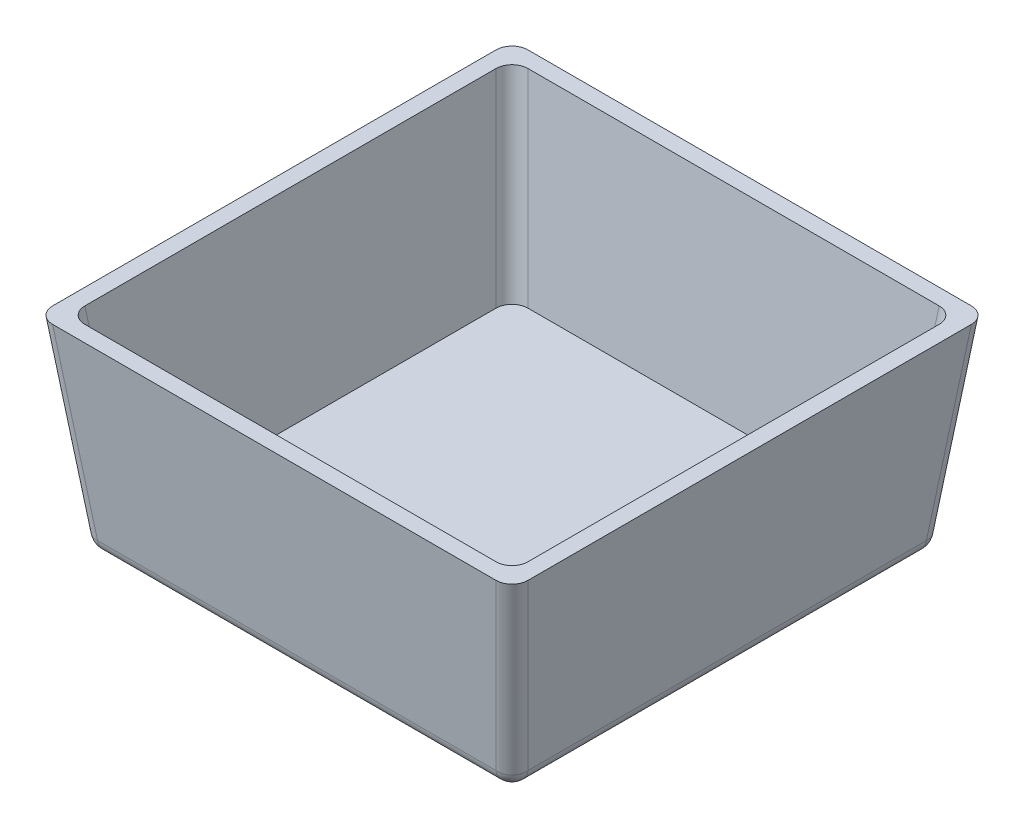
ISO-10303-21;
HEADER;
FILE_DESCRIPTION(('STEP AP214'),'2;1');
FILE_NAME('part.step','',(''),(''),'','','');
FILE_SCHEMA(('AUTOMOTIVE_DESIGN { 1 0 10303 214 1 1 1 1 }'));
ENDSEC;
DATA;
#1=APPLICATION_CONTEXT('core data for automotive mechanical design processes');
#2=APPLICATION_PROTOCOL_DEFINITION('international standard','automotive_design',2000,#1);
#3=PRODUCT_CONTEXT('',#1,'mechanical');
#4=PRODUCT('Part','Part','',(#3));
#5=PRODUCT_RELATED_PRODUCT_CATEGORY('part','',(#4));
#6=PRODUCT_DEFINITION_FORMATION('','',#4);
#7=PRODUCT_DEFINITION_CONTEXT('part definition',#1,'design');
#8=PRODUCT_DEFINITION('design','',#6,#7);
#9=PRODUCT_DEFINITION_SHAPE('','',#8);
#10=(LENGTH_UNIT() NAMED_UNIT(*) SI_UNIT(.MILLI.,.METRE.));
#11=(NAMED_UNIT(*) PLANE_ANGLE_UNIT() SI_UNIT($,.RADIAN.));
#12=(NAMED_UNIT(*) SI_UNIT($,.STERADIAN.) SOLID_ANGLE_UNIT());
#13=UNCERTAINTY_MEASURE_WITH_UNIT(LENGTH_MEASURE(1.E-05),#10,'distance_accuracy_value','');
#14=(GEOMETRIC_REPRESENTATION_CONTEXT(3) GLOBAL_UNCERTAINTY_ASSIGNED_CONTEXT((#13)) GLOBAL_UNIT_ASSIGNED_CONTEXT((#10,
#11,#12)) REPRESENTATION_CONTEXT('',''));
#15=CARTESIAN_POINT('',(0.,0.,0.));
#16=DIRECTION('',(0.,0.,1.));
#17=DIRECTION('',(1.,0.,0.));
#18=AXIS2_PLACEMENT_3D('',#15,#16,#17);
#19=CARTESIAN_POINT('',(0.,-2.89826498422713,-24.1522082018927));
#20=DIRECTION('',(0.,-0.119145220618431,-0.992876838486922));
#21=DIRECTION('',(0.,0.992876838486922,-0.119145220618431));
#22=AXIS2_PLACEMENT_3D('',#19,#20,#21);
#23=PLANE('',#22);
#24=DIRECTION('',(1.,0.,0.));
#25=VECTOR('',#24,1.);
#26=CARTESIAN_POINT('',(-27.5,25.,-27.5));
#27=LINE('',#26,#25);
#28=CARTESIAN_POINT('',(-25.5142463230262,25.,-27.5));
#29=VERTEX_POINT('',#28);
#30=CARTESIAN_POINT('',(25.5142463230261,25.,-27.5));
#31=VERTEX_POINT('',#30);
#32=EDGE_CURVE('E373',#29,#31,#27,.T.);
#33=ORIENTED_EDGE('',*,*,#32,.F.);
#34=DIRECTION('',(-0.118308451008765,0.985903758406374,-0.118308451008765));
#35=VECTOR('',#34,1.);
#36=CARTESIAN_POINT('',(-22.782040697976,2.23161979124889,-24.7677943749499));
#37=LINE('',#36,#35);
#38=CARTESIAN_POINT('',(-22.7542463230262,2.,-24.74));
#39=VERTEX_POINT('',#38);
#40=EDGE_CURVE('E505',#29,#39,#37,.F.);
#41=ORIENTED_EDGE('',*,*,#40,.T.);
#42=DIRECTION('',(-1.,0.,0.));
#43=VECTOR('',#42,1.);
#44=CARTESIAN_POINT('',(0.,2.,-24.74));
#45=LINE('',#44,#43);
#46=CARTESIAN_POINT('',(22.7542463230261,2.,-24.74));
#47=VERTEX_POINT('',#46);
#48=EDGE_CURVE('E282',#47,#39,#45,.T.);
#49=ORIENTED_EDGE('',*,*,#48,.F.);
#50=DIRECTION('',(0.118308451008765,0.985903758406374,-0.118308451008765));
#51=VECTOR('',#50,1.);
#52=CARTESIAN_POINT('',(21.8561931085514,-5.48377678728922,-23.8419467855253));
#53=LINE('',#52,#51);
#54=EDGE_CURVE('E392',#47,#31,#53,.T.);
#55=ORIENTED_EDGE('',*,*,#54,.T.);
#56=EDGE_LOOP('',(#33,#41,#49,#55));
#57=FACE_BOUND('',#56,.T.);
#58=ADVANCED_FACE('F57',(#57),#23,.F.);
#59=CARTESIAN_POINT('',(24.1522082018927,-2.89826498422713,0.));
#60=DIRECTION('',(-0.992876838486922,0.119145220618431,0.));
#61=DIRECTION('',(-0.119145220618431,-0.992876838486922,0.));
#62=AXIS2_PLACEMENT_3D('',#59,#60,#61);
#63=PLANE('',#62);
#64=DIRECTION('',(0.,0.,1.));
#65=VECTOR('',#64,1.);
#66=CARTESIAN_POINT('',(24.74,2.,0.));
#67=LINE('',#66,#65);
#68=CARTESIAN_POINT('',(24.74,2.,-22.7542463230261));
#69=VERTEX_POINT('',#68);
#70=CARTESIAN_POINT('',(24.74,2.,22.7542463230262));
#71=VERTEX_POINT('',#70);
#72=EDGE_CURVE('E425',#69,#71,#67,.T.);
#73=ORIENTED_EDGE('',*,*,#72,.T.);
#74=DIRECTION('',(0.118308451008765,0.985903758406374,0.118308451008765));
#75=VECTOR('',#74,1.);
#76=CARTESIAN_POINT('',(27.5277943749499,25.2316197912489,25.542040697976));
#77=LINE('',#76,#75);
#78=CARTESIAN_POINT('',(27.5,25.,25.5142463230262));
#79=VERTEX_POINT('',#78);
#80=EDGE_CURVE('E500',#71,#79,#77,.T.);
#81=ORIENTED_EDGE('',*,*,#80,.T.);
#82=DIRECTION('',(0.,0.,-1.));
#83=VECTOR('',#82,1.);
#84=CARTESIAN_POINT('',(27.5,25.,27.5));
#85=LINE('',#84,#83);
#86=CARTESIAN_POINT('',(27.5,25.,-25.5142463230261));
#87=VERTEX_POINT('',#86);
#88=EDGE_CURVE('E357',#79,#87,#85,.T.);
#89=ORIENTED_EDGE('',*,*,#88,.T.);
#90=DIRECTION('',(0.118308451008765,0.985903758406374,-0.118308451008765));
#91=VECTOR('',#90,1.);
#92=CARTESIAN_POINT('',(23.8419467855253,-5.48377678728921,-21.8561931085514));
#93=LINE('',#92,#91);
#94=EDGE_CURVE('E503',#87,#69,#93,.F.);
#95=ORIENTED_EDGE('',*,*,#94,.T.);
#96=EDGE_LOOP('',(#73,#81,#89,#95));
#97=FACE_BOUND('',#96,.T.);
#98=ADVANCED_FACE('F536',(#97),#63,.T.);
#99=CARTESIAN_POINT('',(-24.1522082018927,-2.89826498422713,0.));
#100=DIRECTION('',(-0.992876838486922,-0.119145220618431,0.));
#101=DIRECTION('',(0.119145220618431,-0.992876838486922,0.));
#102=AXIS2_PLACEMENT_3D('',#99,#100,#101);
#103=PLANE('',#102);
#104=DIRECTION('',(0.,0.,-1.));
#105=VECTOR('',#104,1.);
#106=CARTESIAN_POINT('',(-27.5,25.,27.5));
#107=LINE('',#106,#105);
#108=CARTESIAN_POINT('',(-27.5,25.,25.5142463230262));
#109=VERTEX_POINT('',#108);
#110=CARTESIAN_POINT('',(-27.5,25.,-25.5142463230261));
#111=VERTEX_POINT('',#110);
#112=EDGE_CURVE('E369',#109,#111,#107,.T.);
#113=ORIENTED_EDGE('',*,*,#112,.F.);
#114=DIRECTION('',(-0.118308451008765,0.985903758406374,0.118308451008765));
#115=VECTOR('',#114,1.);
#116=CARTESIAN_POINT('',(-23.8419467855253,-5.48377678728921,21.8561931085515));
#117=LINE('',#116,#115);
#118=CARTESIAN_POINT('',(-24.74,2.,22.7542463230262));
#119=VERTEX_POINT('',#118);
#120=EDGE_CURVE('E377',#109,#119,#117,.F.);
#121=ORIENTED_EDGE('',*,*,#120,.T.);
#122=DIRECTION('',(0.,0.,1.));
#123=VECTOR('',#122,1.);
#124=CARTESIAN_POINT('',(-24.74,2.,0.));
#125=LINE('',#124,#123);
#126=CARTESIAN_POINT('',(-24.74,2.,-22.7542463230261));
#127=VERTEX_POINT('',#126);
#128=EDGE_CURVE('E428',#127,#119,#125,.T.);
#129=ORIENTED_EDGE('',*,*,#128,.F.);
#130=DIRECTION('',(-0.118308451008765,0.985903758406374,-0.118308451008765));
#131=VECTOR('',#130,1.);
#132=CARTESIAN_POINT('',(-27.5277943749499,25.2316197912489,-25.542040697976));
#133=LINE('',#132,#131);
#134=EDGE_CURVE('E368',#127,#111,#133,.T.);
#135=ORIENTED_EDGE('',*,*,#134,.T.);
#136=EDGE_LOOP('',(#113,#121,#129,#135));
#137=FACE_BOUND('',#136,.T.);
#138=ADVANCED_FACE('F524',(#137),#103,.F.);
#139=CARTESIAN_POINT('',(0.,-2.89826498422713,24.1522082018927));
#140=DIRECTION('',(0.,0.119145220618431,-0.992876838486922));
#141=DIRECTION('',(0.,0.992876838486922,0.119145220618431));
#142=AXIS2_PLACEMENT_3D('',#139,#140,#141);
#143=PLANE('',#142);
#144=DIRECTION('',(-1.,0.,0.));
#145=VECTOR('',#144,1.);
#146=CARTESIAN_POINT('',(0.,2.,24.74));
#147=LINE('',#146,#145);
#148=CARTESIAN_POINT('',(22.7542463230261,2.,24.74));
#149=VERTEX_POINT('',#148);
#150=CARTESIAN_POINT('',(-22.7542463230262,2.,24.74));
#151=VERTEX_POINT('',#150);
#152=EDGE_CURVE('E210',#149,#151,#147,.T.);
#153=ORIENTED_EDGE('',*,*,#152,.T.);
#154=DIRECTION('',(-0.118308451008765,0.985903758406374,0.118308451008765));
#155=VECTOR('',#154,1.);
#156=CARTESIAN_POINT('',(-21.8561931085514,-5.48377678728921,23.8419467855253));
#157=LINE('',#156,#155);
#158=CARTESIAN_POINT('',(-25.5142463230262,25.,27.5));
#159=VERTEX_POINT('',#158);
#160=EDGE_CURVE('E363',#151,#159,#157,.T.);
#161=ORIENTED_EDGE('',*,*,#160,.T.);
#162=DIRECTION('',(1.,0.,0.));
#163=VECTOR('',#162,1.);
#164=CARTESIAN_POINT('',(-27.5,25.,27.5));
#165=LINE('',#164,#163);
#166=CARTESIAN_POINT('',(25.5142463230261,25.,27.5));
#167=VERTEX_POINT('',#166);
#168=EDGE_CURVE('E352',#159,#167,#165,.T.);
#169=ORIENTED_EDGE('',*,*,#168,.T.);
#170=DIRECTION('',(0.118308451008765,0.985903758406374,0.118308451008765));
#171=VECTOR('',#170,1.);
#172=CARTESIAN_POINT('',(22.782040697976,2.2316197912489,24.7677943749499));
#173=LINE('',#172,#171);
#174=EDGE_CURVE('E360',#167,#149,#173,.F.);
#175=ORIENTED_EDGE('',*,*,#174,.T.);
#176=EDGE_LOOP('',(#153,#161,#169,#175));
#177=FACE_BOUND('',#176,.T.);
#178=ADVANCED_FACE('F533',(#177),#143,.T.);
#179=CARTESIAN_POINT('',(0.,25.,0.));
#180=DIRECTION('',(0.,-1.,0.));
#181=DIRECTION('',(0.,0.,-1.));
#182=AXIS2_PLACEMENT_3D('',#179,#180,#181);
#183=PLANE('',#182);
#184=ORIENTED_EDGE('',*,*,#168,.F.);
#185=CARTESIAN_POINT('',(-25.4856514700777,25.,25.4856514700777));
#186=DIRECTION('',(0.,-1.,0.));
#187=DIRECTION('',(-0.707106781186548,0.,0.707106781186547));
#188=AXIS2_PLACEMENT_3D('',#185,#186,#187);
#189=ELLIPSE('',#188,2.02859557329695,2.);
#190=EDGE_CURVE('E482',#159,#109,#189,.T.);
#191=ORIENTED_EDGE('',*,*,#190,.T.);
#192=ORIENTED_EDGE('',*,*,#112,.T.);
#193=CARTESIAN_POINT('',(-25.4856514700777,25.,-25.4856514700777));
#194=DIRECTION('',(0.,-1.,0.));
#195=DIRECTION('',(0.707106781186547,0.,0.707106781186548));
#196=AXIS2_PLACEMENT_3D('',#193,#194,#195);
#197=ELLIPSE('',#196,2.02859557329695,2.);
#198=EDGE_CURVE('E479',#111,#29,#197,.T.);
#199=ORIENTED_EDGE('',*,*,#198,.T.);
#200=ORIENTED_EDGE('',*,*,#32,.T.);
#201=CARTESIAN_POINT('',(25.4856514700777,25.,-25.4856514700777));
#202=DIRECTION('',(0.,-1.,0.));
#203=DIRECTION('',(0.707106781186547,0.,-0.707106781186548));
#204=AXIS2_PLACEMENT_3D('',#201,#202,#203);
#205=ELLIPSE('',#204,2.02859557329695,2.);
#206=EDGE_CURVE('E12',#31,#87,#205,.T.);
#207=ORIENTED_EDGE('',*,*,#206,.T.);
#208=ORIENTED_EDGE('',*,*,#88,.F.);
#209=CARTESIAN_POINT('',(25.4856514700777,25.,25.4856514700777));
#210=DIRECTION('',(0.,-1.,0.));
#211=DIRECTION('',(-0.707106781186548,0.,-0.707106781186547));
#212=AXIS2_PLACEMENT_3D('',#209,#210,#211);
#213=ELLIPSE('',#212,2.02859557329695,2.);
#214=EDGE_CURVE('E68',#79,#167,#213,.T.);
#215=ORIENTED_EDGE('',*,*,#214,.T.);
#216=EDGE_LOOP('',(#184,#191,#192,#199,#200,#207,#208,#215));
#217=FACE_BOUND('',#216,.T.);
#218=DIRECTION('',(1.,0.,0.));
#219=VECTOR('',#218,1.);
#220=CARTESIAN_POINT('',(-29.5,25.,29.5));
#221=LINE('',#220,#219);
#222=CARTESIAN_POINT('',(-27.5142463230262,25.,29.5));
#223=VERTEX_POINT('',#222);
#224=CARTESIAN_POINT('',(27.5142463230261,25.,29.5));
#225=VERTEX_POINT('',#224);
#226=EDGE_CURVE('E61',#223,#225,#221,.T.);
#227=ORIENTED_EDGE('',*,*,#226,.T.);
#228=CARTESIAN_POINT('',(27.4856514700777,25.,27.4856514700777));
#229=DIRECTION('',(0.,-1.,0.));
#230=DIRECTION('',(0.707106781186548,0.,0.707106781186547));
#231=AXIS2_PLACEMENT_3D('',#228,#229,#230);
#232=ELLIPSE('',#231,2.02859557329695,2.);
#233=CARTESIAN_POINT('',(29.5,25.,27.5142463230261));
#234=VERTEX_POINT('',#233);
#235=EDGE_CURVE('E198',#225,#234,#232,.F.);
#236=ORIENTED_EDGE('',*,*,#235,.T.);
#237=DIRECTION('',(0.,0.,-1.));
#238=VECTOR('',#237,1.);
#239=CARTESIAN_POINT('',(29.5,25.,29.5));
#240=LINE('',#239,#238);
#241=CARTESIAN_POINT('',(29.5,25.,-27.5142463230261));
#242=VERTEX_POINT('',#241);
#243=EDGE_CURVE('E211',#234,#242,#240,.T.);
#244=ORIENTED_EDGE('',*,*,#243,.T.);
#245=CARTESIAN_POINT('',(27.4856514700777,25.,-27.4856514700777));
#246=DIRECTION('',(0.,-1.,0.));
#247=DIRECTION('',(-0.707106781186548,0.,0.707106781186547));
#248=AXIS2_PLACEMENT_3D('',#245,#246,#247);
#249=ELLIPSE('',#248,2.02859557329695,2.);
#250=CARTESIAN_POINT('',(27.5142463230261,25.,-29.5));
#251=VERTEX_POINT('',#250);
#252=EDGE_CURVE('E495',#242,#251,#249,.F.);
#253=ORIENTED_EDGE('',*,*,#252,.T.);
#254=DIRECTION('',(1.,0.,0.));
#255=VECTOR('',#254,1.);
#256=CARTESIAN_POINT('',(-29.5,25.,-29.5));
#257=LINE('',#256,#255);
#258=CARTESIAN_POINT('',(-27.5142463230262,25.,-29.5));
#259=VERTEX_POINT('',#258);
#260=EDGE_CURVE('E324',#259,#251,#257,.T.);
#261=ORIENTED_EDGE('',*,*,#260,.F.);
#262=CARTESIAN_POINT('',(-27.4856514700777,25.,-27.4856514700777));
#263=DIRECTION('',(0.,-1.,0.));
#264=DIRECTION('',(-0.707106781186548,0.,-0.707106781186547));
#265=AXIS2_PLACEMENT_3D('',#262,#263,#264);
#266=ELLIPSE('',#265,2.02859557329695,2.);
#267=CARTESIAN_POINT('',(-29.5,25.,-27.5142463230261));
#268=VERTEX_POINT('',#267);
#269=EDGE_CURVE('E199',#259,#268,#266,.F.);
#270=ORIENTED_EDGE('',*,*,#269,.T.);
#271=DIRECTION('',(0.,0.,-1.));
#272=VECTOR('',#271,1.);
#273=CARTESIAN_POINT('',(-29.5,25.,29.5));
#274=LINE('',#273,#272);
#275=CARTESIAN_POINT('',(-29.5,25.,27.5142463230262));
#276=VERTEX_POINT('',#275);
#277=EDGE_CURVE('E192',#276,#268,#274,.T.);
#278=ORIENTED_EDGE('',*,*,#277,.F.);
#279=CARTESIAN_POINT('',(-27.4856514700777,25.,27.4856514700777));
#280=DIRECTION('',(0.,-1.,0.));
#281=DIRECTION('',(0.707106781186548,0.,-0.707106781186547));
#282=AXIS2_PLACEMENT_3D('',#279,#280,#281);
#283=ELLIPSE('',#282,2.02859557329695,2.);
#284=EDGE_CURVE('E186',#276,#223,#283,.F.);
#285=ORIENTED_EDGE('',*,*,#284,.T.);
#286=EDGE_LOOP('',(#227,#236,#244,#253,#261,#270,#278,#285));
#287=FACE_BOUND('',#286,.T.);
#288=ADVANCED_FACE('F188',(#217,#287),#183,.F.);
#289=CARTESIAN_POINT('',(0.,0.,0.));
#290=DIRECTION('',(0.,1.,0.));
#291=DIRECTION('',(0.,0.,1.));
#292=AXIS2_PLACEMENT_3D('',#289,#290,#291);
#293=PLANE('',#292);
#294=DIRECTION('',(0.,0.,-1.));
#295=VECTOR('',#294,1.);
#296=CARTESIAN_POINT('',(24.7256514700777,0.,0.));
#297=LINE('',#296,#295);
#298=CARTESIAN_POINT('',(24.7256514700777,0.,-24.7256514700777));
#299=VERTEX_POINT('',#298);
#300=CARTESIAN_POINT('',(24.7256514700777,0.,24.7256514700777));
#301=VERTEX_POINT('',#300);
#302=EDGE_CURVE('E235',#299,#301,#297,.F.);
#303=ORIENTED_EDGE('',*,*,#302,.T.);
#304=DIRECTION('',(1.,0.,0.));
#305=VECTOR('',#304,1.);
#306=CARTESIAN_POINT('',(0.,0.,24.7256514700777));
#307=LINE('',#306,#305);
#308=CARTESIAN_POINT('',(-24.7256514700777,0.,24.7256514700777));
#309=VERTEX_POINT('',#308);
#310=EDGE_CURVE('E241',#301,#309,#307,.F.);
#311=ORIENTED_EDGE('',*,*,#310,.T.);
#312=DIRECTION('',(0.,0.,-1.));
#313=VECTOR('',#312,1.);
#314=CARTESIAN_POINT('',(-24.7256514700777,0.,-26.5));
#315=LINE('',#314,#313);
#316=CARTESIAN_POINT('',(-24.7256514700777,0.,-24.7256514700777));
#317=VERTEX_POINT('',#316);
#318=EDGE_CURVE('E238',#309,#317,#315,.T.);
#319=ORIENTED_EDGE('',*,*,#318,.T.);
#320=DIRECTION('',(1.,0.,0.));
#321=VECTOR('',#320,1.);
#322=CARTESIAN_POINT('',(26.5,0.,-24.7256514700777));
#323=LINE('',#322,#321);
#324=EDGE_CURVE('E230',#317,#299,#323,.T.);
#325=ORIENTED_EDGE('',*,*,#324,.T.);
#326=EDGE_LOOP('',(#303,#311,#319,#325));
#327=FACE_BOUND('',#326,.T.);
#328=ADVANCED_FACE('F558',(#327),#293,.F.);
#329=CARTESIAN_POINT('',(0.,-3.13485804416404,-26.1238170347003));
#330=DIRECTION('',(0.,-0.119145220618431,-0.992876838486922));
#331=DIRECTION('',(0.,0.992876838486922,-0.119145220618431));
#332=AXIS2_PLACEMENT_3D('',#329,#330,#331);
#333=PLANE('',#332);
#334=DIRECTION('',(1.,0.,0.));
#335=VECTOR('',#334,1.);
#336=CARTESIAN_POINT('',(-26.5,1.76170955876314,-26.7114051470516));
#337=LINE('',#336,#335);
#338=CARTESIAN_POINT('',(24.7256514700777,1.76170955876314,-26.7114051470516));
#339=VERTEX_POINT('',#338);
#340=CARTESIAN_POINT('',(-24.7256514700777,1.76170955876314,-26.7114051470516));
#341=VERTEX_POINT('',#340);
#342=EDGE_CURVE('E568',#339,#341,#337,.F.);
#343=ORIENTED_EDGE('',*,*,#342,.T.);
#344=DIRECTION('',(-0.118308451008765,0.985903758406374,-0.118308451008765));
#345=VECTOR('',#344,1.);
#346=CARTESIAN_POINT('',(-23.8002055502311,-5.95033977329232,-25.7859592272049));
#347=LINE('',#346,#345);
#348=EDGE_CURVE('E364',#341,#259,#347,.T.);
#349=ORIENTED_EDGE('',*,*,#348,.T.);
#350=ORIENTED_EDGE('',*,*,#260,.T.);
#351=DIRECTION('',(0.118308451008765,0.985903758406374,-0.118308451008765));
#352=VECTOR('',#351,1.);
#353=CARTESIAN_POINT('',(24.542040697976,0.231619791248897,-26.5277943749499));
#354=LINE('',#353,#352);
#355=EDGE_CURVE('E317',#251,#339,#354,.F.);
#356=ORIENTED_EDGE('',*,*,#355,.T.);
#357=EDGE_LOOP('',(#343,#349,#350,#356));
#358=FACE_BOUND('',#357,.T.);
#359=ADVANCED_FACE('F560',(#358),#333,.T.);
#360=CARTESIAN_POINT('',(26.1238170347003,-3.13485804416404,0.));
#361=DIRECTION('',(-0.992876838486922,0.119145220618431,0.));
#362=DIRECTION('',(-0.119145220618431,-0.992876838486922,0.));
#363=AXIS2_PLACEMENT_3D('',#360,#361,#362);
#364=PLANE('',#363);
#365=ORIENTED_EDGE('',*,*,#243,.F.);
#366=DIRECTION('',(0.118308451008765,0.985903758406374,0.118308451008765));
#367=VECTOR('',#366,1.);
#368=CARTESIAN_POINT('',(25.7859592272049,-5.95033977329232,23.8002055502311));
#369=LINE('',#368,#367);
#370=CARTESIAN_POINT('',(26.7114051470516,1.76170955876314,24.7256514700777));
#371=VERTEX_POINT('',#370);
#372=EDGE_CURVE('E314',#234,#371,#369,.F.);
#373=ORIENTED_EDGE('',*,*,#372,.T.);
#374=DIRECTION('',(0.,0.,-1.));
#375=VECTOR('',#374,1.);
#376=CARTESIAN_POINT('',(26.7114051470516,1.76170955876314,0.));
#377=LINE('',#376,#375);
#378=CARTESIAN_POINT('',(26.7114051470516,1.76170955876314,-24.7256514700777));
#379=VERTEX_POINT('',#378);
#380=EDGE_CURVE('E308',#371,#379,#377,.T.);
#381=ORIENTED_EDGE('',*,*,#380,.T.);
#382=DIRECTION('',(0.118308451008765,0.985903758406374,-0.118308451008765));
#383=VECTOR('',#382,1.);
#384=CARTESIAN_POINT('',(29.5277943749499,25.2316197912489,-27.542040697976));
#385=LINE('',#384,#383);
#386=EDGE_CURVE('E305',#379,#242,#385,.T.);
#387=ORIENTED_EDGE('',*,*,#386,.T.);
#388=EDGE_LOOP('',(#365,#373,#381,#387));
#389=FACE_BOUND('',#388,.T.);
#390=ADVANCED_FACE('F271',(#389),#364,.F.);
#391=CARTESIAN_POINT('',(-26.1238170347003,-3.13485804416404,0.));
#392=DIRECTION('',(-0.992876838486922,-0.119145220618431,0.));
#393=DIRECTION('',(0.119145220618431,-0.992876838486922,0.));
#394=AXIS2_PLACEMENT_3D('',#391,#392,#393);
#395=PLANE('',#394);
#396=DIRECTION('',(0.,0.,-1.));
#397=VECTOR('',#396,1.);
#398=CARTESIAN_POINT('',(-26.7114051470516,1.76170955876314,26.5));
#399=LINE('',#398,#397);
#400=CARTESIAN_POINT('',(-26.7114051470516,1.76170955876314,-24.7256514700777));
#401=VERTEX_POINT('',#400);
#402=CARTESIAN_POINT('',(-26.7114051470516,1.76170955876314,24.7256514700777));
#403=VERTEX_POINT('',#402);
#404=EDGE_CURVE('E589',#401,#403,#399,.F.);
#405=ORIENTED_EDGE('',*,*,#404,.T.);
#406=DIRECTION('',(-0.118308451008765,0.985903758406374,0.118308451008765));
#407=VECTOR('',#406,1.);
#408=CARTESIAN_POINT('',(-29.5277943749499,25.2316197912489,27.542040697976));
#409=LINE('',#408,#407);
#410=EDGE_CURVE('E309',#403,#276,#409,.T.);
#411=ORIENTED_EDGE('',*,*,#410,.T.);
#412=ORIENTED_EDGE('',*,*,#277,.T.);
#413=DIRECTION('',(-0.118308451008765,0.985903758406374,-0.118308451008765));
#414=VECTOR('',#413,1.);
#415=CARTESIAN_POINT('',(-25.7859592272049,-5.95033977329232,-23.8002055502311));
#416=LINE('',#415,#414);
#417=EDGE_CURVE('E245',#268,#401,#416,.F.);
#418=ORIENTED_EDGE('',*,*,#417,.T.);
#419=EDGE_LOOP('',(#405,#411,#412,#418));
#420=FACE_BOUND('',#419,.T.);
#421=ADVANCED_FACE('F261',(#420),#395,.T.);
#422=CARTESIAN_POINT('',(0.,-3.13485804416403,26.1238170347003));
#423=DIRECTION('',(0.,0.11914522061843,-0.992876838486922));
#424=DIRECTION('',(0.,0.992876838486922,0.11914522061843));
#425=AXIS2_PLACEMENT_3D('',#422,#423,#424);
#426=PLANE('',#425);
#427=DIRECTION('',(1.,0.,0.));
#428=VECTOR('',#427,1.);
#429=CARTESIAN_POINT('',(0.,1.76170955876314,26.7114051470516));
#430=LINE('',#429,#428);
#431=CARTESIAN_POINT('',(-24.7256514700777,1.76170955876314,26.7114051470516));
#432=VERTEX_POINT('',#431);
#433=CARTESIAN_POINT('',(24.7256514700777,1.76170955876314,26.7114051470516));
#434=VERTEX_POINT('',#433);
#435=EDGE_CURVE('E219',#432,#434,#430,.T.);
#436=ORIENTED_EDGE('',*,*,#435,.T.);
#437=DIRECTION('',(0.118308451008765,0.985903758406374,0.118308451008765));
#438=VECTOR('',#437,1.);
#439=CARTESIAN_POINT('',(23.8002055502311,-5.95033977329232,25.7859592272049));
#440=LINE('',#439,#438);
#441=EDGE_CURVE('E208',#434,#225,#440,.T.);
#442=ORIENTED_EDGE('',*,*,#441,.T.);
#443=ORIENTED_EDGE('',*,*,#226,.F.);
#444=DIRECTION('',(-0.118308451008765,0.985903758406374,0.118308451008765));
#445=VECTOR('',#444,1.);
#446=CARTESIAN_POINT('',(-24.542040697976,0.231619791248895,26.5277943749499));
#447=LINE('',#446,#445);
#448=EDGE_CURVE('E205',#223,#432,#447,.F.);
#449=ORIENTED_EDGE('',*,*,#448,.T.);
#450=EDGE_LOOP('',(#436,#442,#443,#449));
#451=FACE_BOUND('',#450,.T.);
#452=ADVANCED_FACE('F204',(#451),#426,.F.);
#453=CARTESIAN_POINT('',(0.,2.,0.));
#454=DIRECTION('',(0.,-1.,0.));
#455=DIRECTION('',(0.,0.,-1.));
#456=AXIS2_PLACEMENT_3D('',#453,#454,#455);
#457=PLANE('',#456);
#458=ORIENTED_EDGE('',*,*,#128,.T.);
#459=CARTESIAN_POINT('',(-22.7256514700777,2.,22.7256514700777));
#460=DIRECTION('',(0.,-1.,0.));
#461=DIRECTION('',(-0.707106781186548,0.,0.707106781186547));
#462=AXIS2_PLACEMENT_3D('',#459,#460,#461);
#463=ELLIPSE('',#462,2.02859557329695,2.);
#464=EDGE_CURVE('E389',#119,#151,#463,.F.);
#465=ORIENTED_EDGE('',*,*,#464,.T.);
#466=ORIENTED_EDGE('',*,*,#152,.F.);
#467=CARTESIAN_POINT('',(22.7256514700777,2.,22.7256514700777));
#468=DIRECTION('',(0.,-1.,0.));
#469=DIRECTION('',(-0.707106781186548,0.,-0.707106781186547));
#470=AXIS2_PLACEMENT_3D('',#467,#468,#469);
#471=ELLIPSE('',#470,2.02859557329695,2.);
#472=EDGE_CURVE('E383',#149,#71,#471,.F.);
#473=ORIENTED_EDGE('',*,*,#472,.T.);
#474=ORIENTED_EDGE('',*,*,#72,.F.);
#475=CARTESIAN_POINT('',(22.7256514700777,2.,-22.7256514700777));
#476=DIRECTION('',(0.,-1.,0.));
#477=DIRECTION('',(0.707106781186547,0.,-0.707106781186548));
#478=AXIS2_PLACEMENT_3D('',#475,#476,#477);
#479=ELLIPSE('',#478,2.02859557329695,2.);
#480=EDGE_CURVE('E380',#69,#47,#479,.F.);
#481=ORIENTED_EDGE('',*,*,#480,.T.);
#482=ORIENTED_EDGE('',*,*,#48,.T.);
#483=CARTESIAN_POINT('',(-22.7256514700777,2.,-22.7256514700777));
#484=DIRECTION('',(0.,-1.,0.));
#485=DIRECTION('',(0.707106781186547,0.,0.707106781186548));
#486=AXIS2_PLACEMENT_3D('',#483,#484,#485);
#487=ELLIPSE('',#486,2.02859557329695,2.);
#488=EDGE_CURVE('E386',#39,#127,#487,.F.);
#489=ORIENTED_EDGE('',*,*,#488,.T.);
#490=EDGE_LOOP('',(#458,#465,#466,#473,#474,#481,#482,#489));
#491=FACE_BOUND('',#490,.T.);
#492=ADVANCED_FACE('F276',(#491),#457,.F.);
#493=CARTESIAN_POINT('',(-23.8002055502311,-5.71204933205546,-23.8002055502311));
#494=DIRECTION('',(-0.118308451008765,0.985903758406374,-0.118308451008765));
#495=DIRECTION('',(-0.992876838486922,-0.119145220618431,0.));
#496=AXIS2_PLACEMENT_3D('',#493,#494,#495);
#497=CYLINDRICAL_SURFACE('',#496,2.);
#498=ORIENTED_EDGE('',*,*,#269,.F.);
#499=ORIENTED_EDGE('',*,*,#348,.F.);
#500=CARTESIAN_POINT('',(-24.7256514700777,2.,-24.7256514700777));
#501=DIRECTION('',(0.118308451008765,-0.985903758406374,0.118308451008765));
#502=DIRECTION('',(0.992876838486922,0.119145220618431,0.));
#503=AXIS2_PLACEMENT_3D('',#500,#501,#502);
#504=CIRCLE('',#503,2.);
#505=EDGE_CURVE('E434',#401,#341,#504,.T.);
#506=ORIENTED_EDGE('',*,*,#505,.F.);
#507=ORIENTED_EDGE('',*,*,#417,.F.);
#508=EDGE_LOOP('',(#498,#499,#506,#507));
#509=FACE_BOUND('',#508,.T.);
#510=ADVANCED_FACE('F578',(#509),#497,.T.);
#511=CARTESIAN_POINT('',(23.8002055502311,-5.71204933205546,-23.8002055502311));
#512=DIRECTION('',(-0.118308451008765,-0.985903758406374,0.118308451008765));
#513=DIRECTION('',(0.992876838486922,-0.119145220618431,0.));
#514=AXIS2_PLACEMENT_3D('',#511,#512,#513);
#515=CYLINDRICAL_SURFACE('',#514,2.);
#516=ORIENTED_EDGE('',*,*,#252,.F.);
#517=ORIENTED_EDGE('',*,*,#386,.F.);
#518=CARTESIAN_POINT('',(24.7256514700777,2.,-24.7256514700777));
#519=DIRECTION('',(-0.118308451008764,-0.985903758406374,0.118308451008765));
#520=DIRECTION('',(0.,-0.119145220618431,-0.992876838486922));
#521=AXIS2_PLACEMENT_3D('',#518,#519,#520);
#522=CIRCLE('',#521,2.);
#523=EDGE_CURVE('E437',#339,#379,#522,.T.);
#524=ORIENTED_EDGE('',*,*,#523,.F.);
#525=ORIENTED_EDGE('',*,*,#355,.F.);
#526=EDGE_LOOP('',(#516,#517,#524,#525));
#527=FACE_BOUND('',#526,.T.);
#528=ADVANCED_FACE('F635',(#527),#515,.T.);
#529=CARTESIAN_POINT('',(0.,2.,-24.7256514700777));
#530=DIRECTION('',(-1.,0.,0.));
#531=DIRECTION('',(0.,0.,1.));
#532=AXIS2_PLACEMENT_3D('',#529,#530,#531);
#533=CYLINDRICAL_SURFACE('',#532,2.);
#534=CARTESIAN_POINT('',(-24.7256514700777,2.,-24.7256514700777));
#535=DIRECTION('',(-1.,0.,0.));
#536=DIRECTION('',(0.,-1.,0.));
#537=AXIS2_PLACEMENT_3D('',#534,#535,#536);
#538=CIRCLE('',#537,2.);
#539=EDGE_CURVE('E416',#341,#317,#538,.T.);
#540=ORIENTED_EDGE('',*,*,#539,.F.);
#541=ORIENTED_EDGE('',*,*,#342,.F.);
#542=CARTESIAN_POINT('',(24.7256514700777,2.,-24.7256514700777));
#543=DIRECTION('',(1.,0.,0.));
#544=DIRECTION('',(0.,0.,-1.));
#545=AXIS2_PLACEMENT_3D('',#542,#543,#544);
#546=CIRCLE('',#545,2.);
#547=EDGE_CURVE('E440',#299,#339,#546,.T.);
#548=ORIENTED_EDGE('',*,*,#547,.F.);
#549=ORIENTED_EDGE('',*,*,#324,.F.);
#550=EDGE_LOOP('',(#540,#541,#548,#549));
#551=FACE_BOUND('',#550,.T.);
#552=ADVANCED_FACE('F582',(#551),#533,.T.);
#553=CARTESIAN_POINT('',(-24.7256514700777,2.,-24.7256514700777));
#554=DIRECTION('',(0.,-1.,0.));
#555=DIRECTION('',(1.,0.,0.));
#556=AXIS2_PLACEMENT_3D('',#553,#554,#555);
#557=SPHERICAL_SURFACE('',#556,2.);
#558=ORIENTED_EDGE('',*,*,#505,.T.);
#559=ORIENTED_EDGE('',*,*,#539,.T.);
#560=CARTESIAN_POINT('',(-24.7256514700777,2.,-24.7256514700777));
#561=DIRECTION('',(0.,0.,-1.));
#562=DIRECTION('',(-1.,0.,0.));
#563=AXIS2_PLACEMENT_3D('',#560,#561,#562);
#564=CIRCLE('',#563,2.);
#565=EDGE_CURVE('E444',#401,#317,#564,.F.);
#566=ORIENTED_EDGE('',*,*,#565,.F.);
#567=EDGE_LOOP('',(#558,#559,#566));
#568=FACE_BOUND('',#567,.T.);
#569=ADVANCED_FACE('F584',(#568),#557,.T.);
#570=CARTESIAN_POINT('',(24.7256514700777,2.,-24.7256514700777));
#571=DIRECTION('',(0.,-1.,0.));
#572=DIRECTION('',(1.,0.,0.));
#573=AXIS2_PLACEMENT_3D('',#570,#571,#572);
#574=SPHERICAL_SURFACE('',#573,2.);
#575=ORIENTED_EDGE('',*,*,#547,.T.);
#576=ORIENTED_EDGE('',*,*,#523,.T.);
#577=CARTESIAN_POINT('',(24.7256514700777,2.,-24.7256514700777));
#578=DIRECTION('',(0.,0.,-1.));
#579=DIRECTION('',(-1.,0.,0.));
#580=AXIS2_PLACEMENT_3D('',#577,#578,#579);
#581=CIRCLE('',#580,2.);
#582=EDGE_CURVE('E448',#299,#379,#581,.F.);
#583=ORIENTED_EDGE('',*,*,#582,.F.);
#584=EDGE_LOOP('',(#575,#576,#583));
#585=FACE_BOUND('',#584,.T.);
#586=ADVANCED_FACE('F627',(#585),#574,.T.);
#587=CARTESIAN_POINT('',(-24.7256514700777,2.,0.));
#588=DIRECTION('',(0.,0.,1.));
#589=DIRECTION('',(1.,0.,0.));
#590=AXIS2_PLACEMENT_3D('',#587,#588,#589);
#591=CYLINDRICAL_SURFACE('',#590,2.);
#592=ORIENTED_EDGE('',*,*,#565,.T.);
#593=ORIENTED_EDGE('',*,*,#318,.F.);
#594=CARTESIAN_POINT('',(-24.7256514700777,2.,24.7256514700777));
#595=DIRECTION('',(0.,0.,1.));
#596=DIRECTION('',(0.,-1.,0.));
#597=AXIS2_PLACEMENT_3D('',#594,#595,#596);
#598=CIRCLE('',#597,2.);
#599=EDGE_CURVE('E452',#403,#309,#598,.T.);
#600=ORIENTED_EDGE('',*,*,#599,.F.);
#601=ORIENTED_EDGE('',*,*,#404,.F.);
#602=EDGE_LOOP('',(#592,#593,#600,#601));
#603=FACE_BOUND('',#602,.T.);
#604=ADVANCED_FACE('F590',(#603),#591,.T.);
#605=CARTESIAN_POINT('',(-23.8002055502311,-5.71204933205546,23.8002055502311));
#606=DIRECTION('',(0.118308451008765,-0.985903758406374,-0.118308451008765));
#607=DIRECTION('',(0.992876838486922,0.119145220618431,0.));
#608=AXIS2_PLACEMENT_3D('',#605,#606,#607);
#609=CYLINDRICAL_SURFACE('',#608,2.);
#610=ORIENTED_EDGE('',*,*,#284,.F.);
#611=ORIENTED_EDGE('',*,*,#410,.F.);
#612=CARTESIAN_POINT('',(-24.7256514700777,2.,24.7256514700777));
#613=DIRECTION('',(0.118308451008765,-0.985903758406374,-0.118308451008765));
#614=DIRECTION('',(0.992876838486922,0.119145220618431,0.));
#615=AXIS2_PLACEMENT_3D('',#612,#613,#614);
#616=CIRCLE('',#615,2.);
#617=EDGE_CURVE('E216',#432,#403,#616,.T.);
#618=ORIENTED_EDGE('',*,*,#617,.F.);
#619=ORIENTED_EDGE('',*,*,#448,.F.);
#620=EDGE_LOOP('',(#610,#611,#618,#619));
#621=FACE_BOUND('',#620,.T.);
#622=ADVANCED_FACE('F214',(#621),#609,.T.);
#623=CARTESIAN_POINT('',(23.8002055502311,-5.71204933205546,23.8002055502311));
#624=DIRECTION('',(0.118308451008765,0.985903758406374,0.118308451008765));
#625=DIRECTION('',(-0.992876838486922,0.119145220618431,0.));
#626=AXIS2_PLACEMENT_3D('',#623,#624,#625);
#627=CYLINDRICAL_SURFACE('',#626,2.);
#628=ORIENTED_EDGE('',*,*,#235,.F.);
#629=ORIENTED_EDGE('',*,*,#441,.F.);
#630=CARTESIAN_POINT('',(24.7256514700777,2.,24.7256514700777));
#631=DIRECTION('',(-0.118308451008765,-0.985903758406374,-0.118308451008765));
#632=DIRECTION('',(0.,0.119145220618431,-0.992876838486922));
#633=AXIS2_PLACEMENT_3D('',#630,#631,#632);
#634=CIRCLE('',#633,2.);
#635=EDGE_CURVE('E458',#371,#434,#634,.T.);
#636=ORIENTED_EDGE('',*,*,#635,.F.);
#637=ORIENTED_EDGE('',*,*,#372,.F.);
#638=EDGE_LOOP('',(#628,#629,#636,#637));
#639=FACE_BOUND('',#638,.T.);
#640=ADVANCED_FACE('F618',(#639),#627,.T.);
#641=CARTESIAN_POINT('',(24.7256514700777,2.,0.));
#642=DIRECTION('',(0.,0.,-1.));
#643=DIRECTION('',(-1.,0.,0.));
#644=AXIS2_PLACEMENT_3D('',#641,#642,#643);
#645=CYLINDRICAL_SURFACE('',#644,2.);
#646=ORIENTED_EDGE('',*,*,#582,.T.);
#647=ORIENTED_EDGE('',*,*,#380,.F.);
#648=CARTESIAN_POINT('',(24.7256514700777,2.,24.7256514700777));
#649=DIRECTION('',(0.,0.,1.));
#650=DIRECTION('',(1.,0.,0.));
#651=AXIS2_PLACEMENT_3D('',#648,#649,#650);
#652=CIRCLE('',#651,2.);
#653=EDGE_CURVE('E462',#301,#371,#652,.T.);
#654=ORIENTED_EDGE('',*,*,#653,.F.);
#655=ORIENTED_EDGE('',*,*,#302,.F.);
#656=EDGE_LOOP('',(#646,#647,#654,#655));
#657=FACE_BOUND('',#656,.T.);
#658=ADVANCED_FACE('F615',(#657),#645,.T.);
#659=CARTESIAN_POINT('',(-24.7256514700777,2.,24.7256514700777));
#660=DIRECTION('',(0.,-1.,0.));
#661=DIRECTION('',(1.,0.,0.));
#662=AXIS2_PLACEMENT_3D('',#659,#660,#661);
#663=SPHERICAL_SURFACE('',#662,2.);
#664=ORIENTED_EDGE('',*,*,#617,.T.);
#665=ORIENTED_EDGE('',*,*,#599,.T.);
#666=CARTESIAN_POINT('',(-24.7256514700777,2.,24.7256514700777));
#667=DIRECTION('',(-1.,0.,0.));
#668=DIRECTION('',(0.,0.,1.));
#669=AXIS2_PLACEMENT_3D('',#666,#667,#668);
#670=CIRCLE('',#669,2.);
#671=EDGE_CURVE('E466',#432,#309,#670,.F.);
#672=ORIENTED_EDGE('',*,*,#671,.F.);
#673=EDGE_LOOP('',(#664,#665,#672));
#674=FACE_BOUND('',#673,.T.);
#675=ADVANCED_FACE('F601',(#674),#663,.T.);
#676=CARTESIAN_POINT('',(24.7256514700777,2.,24.7256514700777));
#677=DIRECTION('',(0.,-1.,0.));
#678=DIRECTION('',(1.,0.,0.));
#679=AXIS2_PLACEMENT_3D('',#676,#677,#678);
#680=SPHERICAL_SURFACE('',#679,2.);
#681=ORIENTED_EDGE('',*,*,#653,.T.);
#682=ORIENTED_EDGE('',*,*,#635,.T.);
#683=CARTESIAN_POINT('',(24.7256514700777,2.,24.7256514700777));
#684=DIRECTION('',(1.,0.,0.));
#685=DIRECTION('',(0.,0.,-1.));
#686=AXIS2_PLACEMENT_3D('',#683,#684,#685);
#687=CIRCLE('',#686,2.);
#688=EDGE_CURVE('E469',#301,#434,#687,.F.);
#689=ORIENTED_EDGE('',*,*,#688,.F.);
#690=EDGE_LOOP('',(#681,#682,#689));
#691=FACE_BOUND('',#690,.T.);
#692=ADVANCED_FACE('F604',(#691),#680,.T.);
#693=CARTESIAN_POINT('',(0.,2.,24.7256514700777));
#694=DIRECTION('',(1.,0.,0.));
#695=DIRECTION('',(0.,0.,-1.));
#696=AXIS2_PLACEMENT_3D('',#693,#694,#695);
#697=CYLINDRICAL_SURFACE('',#696,2.);
#698=ORIENTED_EDGE('',*,*,#671,.T.);
#699=ORIENTED_EDGE('',*,*,#310,.F.);
#700=ORIENTED_EDGE('',*,*,#688,.T.);
#701=ORIENTED_EDGE('',*,*,#435,.F.);
#702=EDGE_LOOP('',(#698,#699,#700,#701));
#703=FACE_BOUND('',#702,.T.);
#704=ADVANCED_FACE('F602',(#703),#697,.T.);
#705=CARTESIAN_POINT('',(-21.8561931085514,-5.24548634605235,21.8561931085515));
#706=DIRECTION('',(-0.118308451008765,0.985903758406374,0.118308451008765));
#707=DIRECTION('',(-0.992876838486922,-0.119145220618431,0.));
#708=AXIS2_PLACEMENT_3D('',#705,#706,#707);
#709=CYLINDRICAL_SURFACE('',#708,2.);
#710=ORIENTED_EDGE('',*,*,#464,.F.);
#711=ORIENTED_EDGE('',*,*,#120,.F.);
#712=ORIENTED_EDGE('',*,*,#190,.F.);
#713=ORIENTED_EDGE('',*,*,#160,.F.);
#714=EDGE_LOOP('',(#710,#711,#712,#713));
#715=FACE_BOUND('',#714,.T.);
#716=ADVANCED_FACE('F531',(#715),#709,.F.);
#717=CARTESIAN_POINT('',(-21.8561931085514,-5.24548634605235,-21.8561931085514));
#718=DIRECTION('',(0.118308451008765,-0.985903758406374,0.118308451008765));
#719=DIRECTION('',(0.,-0.119145220618431,-0.992876838486922));
#720=AXIS2_PLACEMENT_3D('',#717,#718,#719);
#721=CYLINDRICAL_SURFACE('',#720,2.);
#722=ORIENTED_EDGE('',*,*,#488,.F.);
#723=ORIENTED_EDGE('',*,*,#40,.F.);
#724=ORIENTED_EDGE('',*,*,#198,.F.);
#725=ORIENTED_EDGE('',*,*,#134,.F.);
#726=EDGE_LOOP('',(#722,#723,#724,#725));
#727=FACE_BOUND('',#726,.T.);
#728=ADVANCED_FACE('F521',(#727),#721,.F.);
#729=CARTESIAN_POINT('',(21.8561931085514,-5.24548634605235,21.8561931085515));
#730=DIRECTION('',(-0.118308451008765,-0.985903758406374,-0.118308451008765));
#731=DIRECTION('',(0.992876838486922,-0.119145220618431,0.));
#732=AXIS2_PLACEMENT_3D('',#729,#730,#731);
#733=CYLINDRICAL_SURFACE('',#732,2.);
#734=ORIENTED_EDGE('',*,*,#472,.F.);
#735=ORIENTED_EDGE('',*,*,#174,.F.);
#736=ORIENTED_EDGE('',*,*,#214,.F.);
#737=ORIENTED_EDGE('',*,*,#80,.F.);
#738=EDGE_LOOP('',(#734,#735,#736,#737));
#739=FACE_BOUND('',#738,.T.);
#740=ADVANCED_FACE('F539',(#739),#733,.F.);
#741=CARTESIAN_POINT('',(21.8561931085514,-5.24548634605235,-21.8561931085514));
#742=DIRECTION('',(0.118308451008765,0.985903758406374,-0.118308451008765));
#743=DIRECTION('',(0.,0.119145220618431,0.992876838486922));
#744=AXIS2_PLACEMENT_3D('',#741,#742,#743);
#745=CYLINDRICAL_SURFACE('',#744,2.);
#746=ORIENTED_EDGE('',*,*,#480,.F.);
#747=ORIENTED_EDGE('',*,*,#94,.F.);
#748=ORIENTED_EDGE('',*,*,#206,.F.);
#749=ORIENTED_EDGE('',*,*,#54,.F.);
#750=EDGE_LOOP('',(#746,#747,#748,#749));
#751=FACE_BOUND('',#750,.T.);
#752=ADVANCED_FACE('F59',(#751),#745,.F.);
#753=CLOSED_SHELL('',(#58,#98,#138,#178,#288,#328,#359,#390,#421,#452,#492,#510,#528,#552,#569,
#586,#604,#622,#640,#658,#675,#692,#704,#716,#728,#740,#752));
#754=MANIFOLD_SOLID_BREP('B2',#753);
#755=ADVANCED_BREP_SHAPE_REPRESENTATION('',(#18,#754),#14);
#756=SHAPE_DEFINITION_REPRESENTATION(#9,#755);
ENDSEC;
END-ISO-10303-21;
